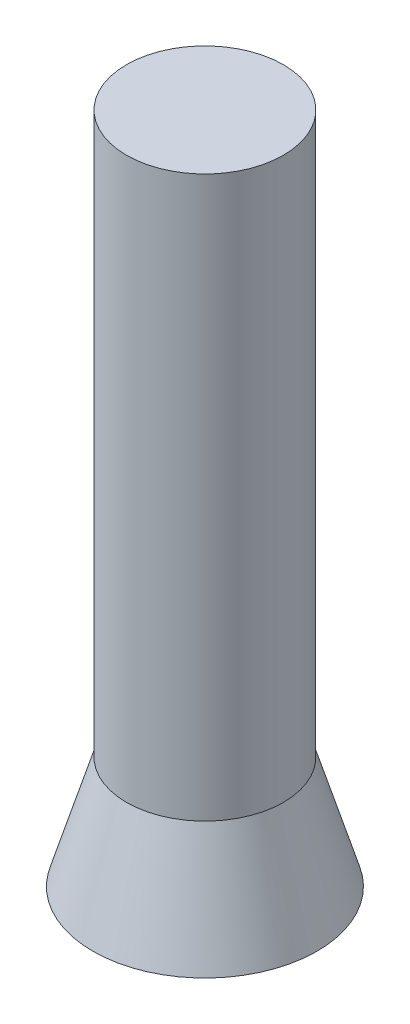
ISO-10303-21;
HEADER;
FILE_DESCRIPTION(('STEP AP214'),'2;1');
FILE_NAME('part.step','',(''),(''),'','','');
FILE_SCHEMA(('AUTOMOTIVE_DESIGN { 1 0 10303 214 1 1 1 1 }'));
ENDSEC;
DATA;
#1=APPLICATION_CONTEXT('core data for automotive mechanical design processes');
#2=APPLICATION_PROTOCOL_DEFINITION('international standard','automotive_design',2000,#1);
#3=PRODUCT_CONTEXT('',#1,'mechanical');
#4=PRODUCT('Part','Part','',(#3));
#5=PRODUCT_RELATED_PRODUCT_CATEGORY('part','',(#4));
#6=PRODUCT_DEFINITION_FORMATION('','',#4);
#7=PRODUCT_DEFINITION_CONTEXT('part definition',#1,'design');
#8=PRODUCT_DEFINITION('design','',#6,#7);
#9=PRODUCT_DEFINITION_SHAPE('','',#8);
#10=(LENGTH_UNIT() NAMED_UNIT(*) SI_UNIT(.MILLI.,.METRE.));
#11=(NAMED_UNIT(*) PLANE_ANGLE_UNIT() SI_UNIT($,.RADIAN.));
#12=(NAMED_UNIT(*) SI_UNIT($,.STERADIAN.) SOLID_ANGLE_UNIT());
#13=UNCERTAINTY_MEASURE_WITH_UNIT(LENGTH_MEASURE(1.E-05),#10,'distance_accuracy_value','');
#14=(GEOMETRIC_REPRESENTATION_CONTEXT(3) GLOBAL_UNCERTAINTY_ASSIGNED_CONTEXT((#13)) GLOBAL_UNIT_ASSIGNED_CONTEXT((#10,
#11,#12)) REPRESENTATION_CONTEXT('',''));
#15=CARTESIAN_POINT('',(0.,0.,0.));
#16=DIRECTION('',(0.,0.,1.));
#17=DIRECTION('',(1.,0.,0.));
#18=AXIS2_PLACEMENT_3D('',#15,#16,#17);
#19=CARTESIAN_POINT('',(0.,0.,0.));
#20=DIRECTION('',(0.,-1.,0.));
#21=DIRECTION('',(0.,0.,-1.));
#22=AXIS2_PLACEMENT_3D('',#19,#20,#21);
#23=CONICAL_SURFACE('',#22,4.,0.291456794477867);
#24=CARTESIAN_POINT('',(0.,4.,0.));
#25=DIRECTION('',(0.,1.,0.));
#26=DIRECTION('',(0.,0.,1.));
#27=AXIS2_PLACEMENT_3D('',#24,#25,#26);
#28=CIRCLE('',#27,2.8);
#29=CARTESIAN_POINT('',(0.,4.,2.8));
#30=VERTEX_POINT('',#29);
#31=EDGE_CURVE('E10',#30,#30,#28,.T.);
#32=ORIENTED_EDGE('',*,*,#31,.F.);
#33=EDGE_LOOP('',(#32));
#34=FACE_BOUND('',#33,.T.);
#35=CARTESIAN_POINT('',(0.,0.,0.));
#36=DIRECTION('',(0.,1.,0.));
#37=DIRECTION('',(0.,0.,1.));
#38=AXIS2_PLACEMENT_3D('',#35,#36,#37);
#39=CIRCLE('',#38,4.);
#40=CARTESIAN_POINT('',(0.,0.,4.));
#41=VERTEX_POINT('',#40);
#42=EDGE_CURVE('E57',#41,#41,#39,.T.);
#43=ORIENTED_EDGE('',*,*,#42,.T.);
#44=EDGE_LOOP('',(#43));
#45=FACE_BOUND('',#44,.T.);
#46=ADVANCED_FACE('F38',(#34,#45),#23,.T.);
#47=CARTESIAN_POINT('',(0.,24.,0.));
#48=DIRECTION('',(0.,1.,0.));
#49=DIRECTION('',(0.,0.,1.));
#50=AXIS2_PLACEMENT_3D('',#47,#48,#49);
#51=CYLINDRICAL_SURFACE('',#50,2.8);
#52=CARTESIAN_POINT('',(0.,24.,0.));
#53=DIRECTION('',(0.,1.,0.));
#54=DIRECTION('',(0.,0.,1.));
#55=AXIS2_PLACEMENT_3D('',#52,#53,#54);
#56=CIRCLE('',#55,2.8);
#57=CARTESIAN_POINT('',(0.,24.,2.8));
#58=VERTEX_POINT('',#57);
#59=EDGE_CURVE('E44',#58,#58,#56,.T.);
#60=ORIENTED_EDGE('',*,*,#59,.F.);
#61=EDGE_LOOP('',(#60));
#62=FACE_BOUND('',#61,.T.);
#63=ORIENTED_EDGE('',*,*,#31,.T.);
#64=EDGE_LOOP('',(#63));
#65=FACE_BOUND('',#64,.T.);
#66=ADVANCED_FACE('F81',(#62,#65),#51,.T.);
#67=CARTESIAN_POINT('',(0.,24.,-2.8));
#68=DIRECTION('',(0.,-1.,0.));
#69=DIRECTION('',(0.,0.,-1.));
#70=AXIS2_PLACEMENT_3D('',#67,#68,#69);
#71=PLANE('',#70);
#72=ORIENTED_EDGE('',*,*,#59,.T.);
#73=EDGE_LOOP('',(#72));
#74=FACE_BOUND('',#73,.T.);
#75=ADVANCED_FACE('F76',(#74),#71,.F.);
#76=CARTESIAN_POINT('',(0.,8.,-1.6));
#77=DIRECTION('',(0.,1.,0.));
#78=DIRECTION('',(0.,0.,1.));
#79=AXIS2_PLACEMENT_3D('',#76,#77,#78);
#80=PLANE('',#79);
#81=CARTESIAN_POINT('',(0.,8.,0.));
#82=DIRECTION('',(0.,1.,0.));
#83=DIRECTION('',(0.,0.,1.));
#84=AXIS2_PLACEMENT_3D('',#81,#82,#83);
#85=CIRCLE('',#84,1.6);
#86=CARTESIAN_POINT('',(0.,8.,1.6));
#87=VERTEX_POINT('',#86);
#88=EDGE_CURVE('E48',#87,#87,#85,.T.);
#89=ORIENTED_EDGE('',*,*,#88,.F.);
#90=EDGE_LOOP('',(#89));
#91=FACE_BOUND('',#90,.T.);
#92=ADVANCED_FACE('F71',(#91),#80,.F.);
#93=CARTESIAN_POINT('',(0.,24.,0.));
#94=DIRECTION('',(0.,1.,0.));
#95=DIRECTION('',(0.,0.,1.));
#96=AXIS2_PLACEMENT_3D('',#93,#94,#95);
#97=CYLINDRICAL_SURFACE('',#96,1.6);
#98=CARTESIAN_POINT('',(0.,0.,0.));
#99=DIRECTION('',(0.,1.,0.));
#100=DIRECTION('',(0.,0.,1.));
#101=AXIS2_PLACEMENT_3D('',#98,#99,#100);
#102=CIRCLE('',#101,1.6);
#103=CARTESIAN_POINT('',(0.,0.,1.6));
#104=VERTEX_POINT('',#103);
#105=EDGE_CURVE('E52',#104,#104,#102,.T.);
#106=ORIENTED_EDGE('',*,*,#105,.F.);
#107=EDGE_LOOP('',(#106));
#108=FACE_BOUND('',#107,.T.);
#109=ORIENTED_EDGE('',*,*,#88,.T.);
#110=EDGE_LOOP('',(#109));
#111=FACE_BOUND('',#110,.T.);
#112=ADVANCED_FACE('F65',(#108,#111),#97,.F.);
#113=CARTESIAN_POINT('',(0.,0.,-1.6));
#114=DIRECTION('',(0.,1.,0.));
#115=DIRECTION('',(0.,0.,1.));
#116=AXIS2_PLACEMENT_3D('',#113,#114,#115);
#117=PLANE('',#116);
#118=ORIENTED_EDGE('',*,*,#42,.F.);
#119=EDGE_LOOP('',(#118));
#120=FACE_BOUND('',#119,.T.);
#121=ORIENTED_EDGE('',*,*,#105,.T.);
#122=EDGE_LOOP('',(#121));
#123=FACE_BOUND('',#122,.T.);
#124=ADVANCED_FACE('F62',(#120,#123),#117,.F.);
#125=CLOSED_SHELL('',(#46,#66,#75,#92,#112,#124));
#126=MANIFOLD_SOLID_BREP('B2',#125);
#127=ADVANCED_BREP_SHAPE_REPRESENTATION('',(#18,#126),#14);
#128=SHAPE_DEFINITION_REPRESENTATION(#9,#127);
ENDSEC;
END-ISO-10303-21;
